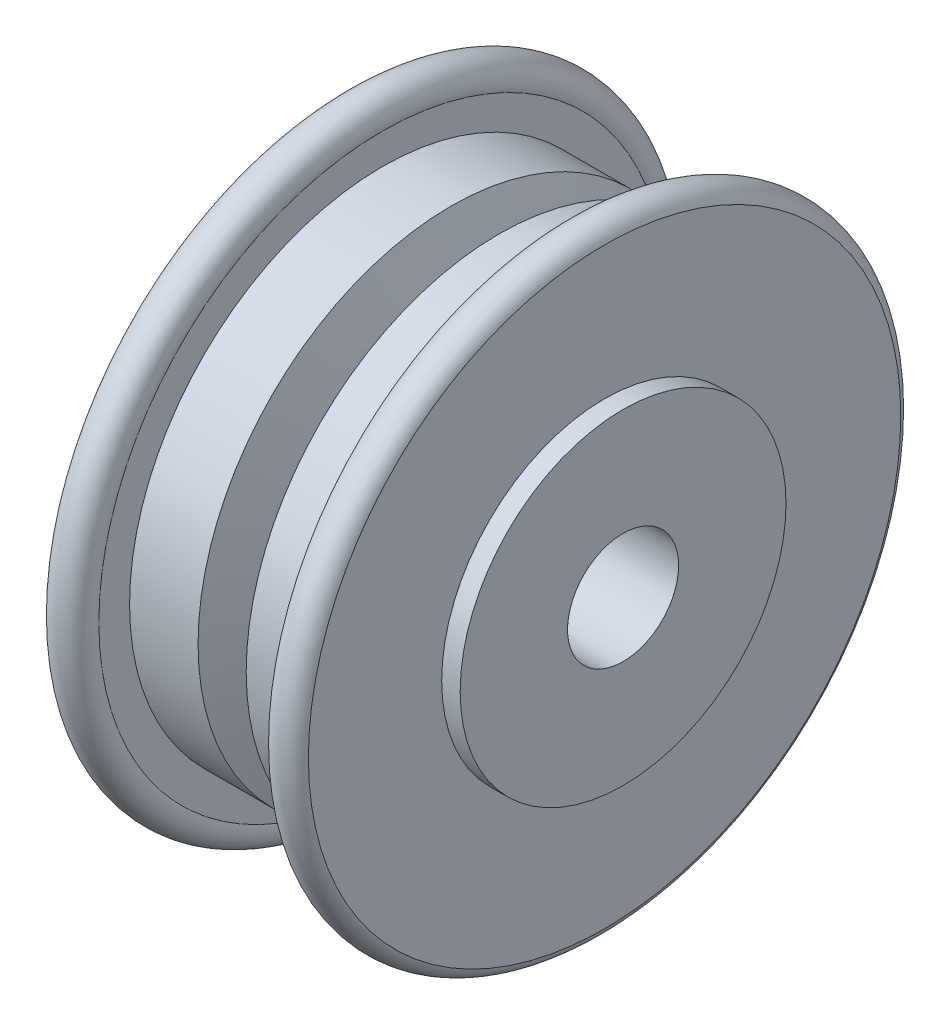
ISO-10303-21;
HEADER;
FILE_DESCRIPTION(('STEP AP214'),'2;1');
FILE_NAME('part.step','',(''),(''),'','','');
FILE_SCHEMA(('AUTOMOTIVE_DESIGN { 1 0 10303 214 1 1 1 1 }'));
ENDSEC;
DATA;
#1=APPLICATION_CONTEXT('core data for automotive mechanical design processes');
#2=APPLICATION_PROTOCOL_DEFINITION('international standard','automotive_design',2000,#1);
#3=PRODUCT_CONTEXT('',#1,'mechanical');
#4=PRODUCT('Part','Part','',(#3));
#5=PRODUCT_RELATED_PRODUCT_CATEGORY('part','',(#4));
#6=PRODUCT_DEFINITION_FORMATION('','',#4);
#7=PRODUCT_DEFINITION_CONTEXT('part definition',#1,'design');
#8=PRODUCT_DEFINITION('design','',#6,#7);
#9=PRODUCT_DEFINITION_SHAPE('','',#8);
#10=(LENGTH_UNIT() NAMED_UNIT(*) SI_UNIT(.MILLI.,.METRE.));
#11=(NAMED_UNIT(*) PLANE_ANGLE_UNIT() SI_UNIT($,.RADIAN.));
#12=(NAMED_UNIT(*) SI_UNIT($,.STERADIAN.) SOLID_ANGLE_UNIT());
#13=UNCERTAINTY_MEASURE_WITH_UNIT(LENGTH_MEASURE(1.E-05),#10,'distance_accuracy_value','');
#14=(GEOMETRIC_REPRESENTATION_CONTEXT(3) GLOBAL_UNCERTAINTY_ASSIGNED_CONTEXT((#13)) GLOBAL_UNIT_ASSIGNED_CONTEXT((#10,
#11,#12)) REPRESENTATION_CONTEXT('',''));
#15=CARTESIAN_POINT('',(0.,0.,0.));
#16=DIRECTION('',(0.,0.,1.));
#17=DIRECTION('',(1.,0.,0.));
#18=AXIS2_PLACEMENT_3D('',#15,#16,#17);
#19=CARTESIAN_POINT('',(4.99999999999886,-1.2872436702413E-13,0.));
#20=DIRECTION('',(1.,0.,0.));
#21=DIRECTION('',(0.,0.,-1.));
#22=AXIS2_PLACEMENT_3D('',#19,#20,#21);
#23=PLANE('',#22);
#24=CARTESIAN_POINT('',(4.99999999999886,0.,0.));
#25=DIRECTION('',(1.,0.,0.));
#26=DIRECTION('',(0.,0.,-1.));
#27=AXIS2_PLACEMENT_3D('',#24,#25,#26);
#28=CIRCLE('',#27,30.);
#29=CARTESIAN_POINT('',(4.99999999999886,0.,-30.));
#30=VERTEX_POINT('',#29);
#31=EDGE_CURVE('E102',#30,#30,#28,.T.);
#32=ORIENTED_EDGE('',*,*,#31,.F.);
#33=EDGE_LOOP('',(#32));
#34=FACE_BOUND('',#33,.T.);
#35=CARTESIAN_POINT('',(4.99999999999999,0.,0.));
#36=DIRECTION('',(-1.,0.,0.));
#37=DIRECTION('',(0.,0.,1.));
#38=AXIS2_PLACEMENT_3D('',#35,#36,#37);
#39=CIRCLE('',#38,88.);
#40=CARTESIAN_POINT('',(4.99999999999999,0.,88.));
#41=VERTEX_POINT('',#40);
#42=EDGE_CURVE('E10',#41,#41,#39,.T.);
#43=ORIENTED_EDGE('',*,*,#42,.F.);
#44=EDGE_LOOP('',(#43));
#45=FACE_BOUND('',#44,.T.);
#46=ADVANCED_FACE('F43',(#34,#45),#23,.T.);
#47=CARTESIAN_POINT('',(0.,0.,0.));
#48=DIRECTION('',(-1.,0.,0.));
#49=DIRECTION('',(0.,0.,1.));
#50=AXIS2_PLACEMENT_3D('',#47,#48,#49);
#51=CYLINDRICAL_SURFACE('',#50,88.);
#52=CARTESIAN_POINT('',(-4.99999999999903,0.,0.));
#53=DIRECTION('',(-1.,0.,0.));
#54=DIRECTION('',(0.,0.,1.));
#55=AXIS2_PLACEMENT_3D('',#52,#53,#54);
#56=CIRCLE('',#55,88.);
#57=CARTESIAN_POINT('',(-4.99999999999903,0.,88.));
#58=VERTEX_POINT('',#57);
#59=EDGE_CURVE('E51',#58,#58,#56,.T.);
#60=ORIENTED_EDGE('',*,*,#59,.F.);
#61=EDGE_LOOP('',(#60));
#62=FACE_BOUND('',#61,.T.);
#63=ORIENTED_EDGE('',*,*,#42,.T.);
#64=EDGE_LOOP('',(#63));
#65=FACE_BOUND('',#64,.T.);
#66=ADVANCED_FACE('F123',(#62,#65),#51,.T.);
#67=CARTESIAN_POINT('',(-4.99999999999956,0.,0.));
#68=DIRECTION('',(1.,0.,0.));
#69=DIRECTION('',(0.,0.,-1.));
#70=AXIS2_PLACEMENT_3D('',#67,#68,#69);
#71=PLANE('',#70);
#72=ORIENTED_EDGE('',*,*,#59,.T.);
#73=EDGE_LOOP('',(#72));
#74=FACE_BOUND('',#73,.T.);
#75=CARTESIAN_POINT('',(-5.00000000000009,0.,0.));
#76=DIRECTION('',(-1.,0.,0.));
#77=DIRECTION('',(0.,0.,1.));
#78=AXIS2_PLACEMENT_3D('',#75,#76,#77);
#79=CIRCLE('',#78,160.);
#80=CARTESIAN_POINT('',(-5.00000000000009,0.,160.));
#81=VERTEX_POINT('',#80);
#82=EDGE_CURVE('E56',#81,#81,#79,.T.);
#83=ORIENTED_EDGE('',*,*,#82,.F.);
#84=EDGE_LOOP('',(#83));
#85=FACE_BOUND('',#84,.T.);
#86=ADVANCED_FACE('F128',(#74,#85),#71,.T.);
#87=CARTESIAN_POINT('',(-15.,0.,0.));
#88=DIRECTION('',(-1.,0.,0.));
#89=DIRECTION('',(0.,0.,1.));
#90=AXIS2_PLACEMENT_3D('',#87,#88,#89);
#91=TOROIDAL_SURFACE('',#90,156.596377259921,10.5633634679861);
#92=CARTESIAN_POINT('',(-25.0000000000001,0.,0.));
#93=DIRECTION('',(-1.,0.,0.));
#94=DIRECTION('',(0.,0.,1.));
#95=AXIS2_PLACEMENT_3D('',#92,#93,#94);
#96=CIRCLE('',#95,153.192754519842);
#97=CARTESIAN_POINT('',(-25.0000000000001,0.,153.192754519842));
#98=VERTEX_POINT('',#97);
#99=EDGE_CURVE('E62',#98,#98,#96,.T.);
#100=ORIENTED_EDGE('',*,*,#99,.F.);
#101=EDGE_LOOP('',(#100));
#102=FACE_BOUND('',#101,.T.);
#103=ORIENTED_EDGE('',*,*,#82,.T.);
#104=EDGE_LOOP('',(#103));
#105=FACE_BOUND('',#104,.T.);
#106=ADVANCED_FACE('F134',(#102,#105),#91,.T.);
#107=CARTESIAN_POINT('',(-25.0000000000002,4.54084213086385E-13,0.));
#108=DIRECTION('',(-1.,0.,0.));
#109=DIRECTION('',(0.,0.,1.));
#110=AXIS2_PLACEMENT_3D('',#107,#108,#109);
#111=PLANE('',#110);
#112=ORIENTED_EDGE('',*,*,#99,.T.);
#113=EDGE_LOOP('',(#112));
#114=FACE_BOUND('',#113,.T.);
#115=CARTESIAN_POINT('',(-25.0000000000002,0.,0.));
#116=DIRECTION('',(-1.,0.,0.));
#117=DIRECTION('',(0.,0.,1.));
#118=AXIS2_PLACEMENT_3D('',#115,#116,#117);
#119=CIRCLE('',#118,136.596377259921);
#120=CARTESIAN_POINT('',(-25.0000000000002,0.,136.596377259921));
#121=VERTEX_POINT('',#120);
#122=EDGE_CURVE('E66',#121,#121,#119,.T.);
#123=ORIENTED_EDGE('',*,*,#122,.F.);
#124=EDGE_LOOP('',(#123));
#125=FACE_BOUND('',#124,.T.);
#126=ADVANCED_FACE('F141',(#114,#125),#111,.T.);
#127=CARTESIAN_POINT('',(0.,0.,0.));
#128=DIRECTION('',(-1.,0.,0.));
#129=DIRECTION('',(0.,0.,1.));
#130=AXIS2_PLACEMENT_3D('',#127,#128,#129);
#131=CYLINDRICAL_SURFACE('',#130,136.596377259921);
#132=ORIENTED_EDGE('',*,*,#122,.T.);
#133=EDGE_LOOP('',(#132));
#134=FACE_BOUND('',#133,.T.);
#135=CARTESIAN_POINT('',(-62.0000000000001,0.,0.));
#136=DIRECTION('',(-1.,0.,0.));
#137=DIRECTION('',(0.,0.,1.));
#138=AXIS2_PLACEMENT_3D('',#135,#136,#137);
#139=CIRCLE('',#138,136.596377259921);
#140=CARTESIAN_POINT('',(-62.0000000000001,0.,136.596377259921));
#141=VERTEX_POINT('',#140);
#142=EDGE_CURVE('E70',#141,#141,#139,.T.);
#143=ORIENTED_EDGE('',*,*,#142,.F.);
#144=EDGE_LOOP('',(#143));
#145=FACE_BOUND('',#144,.T.);
#146=ADVANCED_FACE('F145',(#134,#145),#131,.T.);
#147=CARTESIAN_POINT('',(-62.0000000000001,0.,0.));
#148=DIRECTION('',(1.,0.,0.));
#149=DIRECTION('',(0.,0.,-1.));
#150=AXIS2_PLACEMENT_3D('',#147,#148,#149);
#151=CONICAL_SURFACE('',#150,136.596377259921,1.24374048398407);
#152=CARTESIAN_POINT('',(-75.,0.,0.));
#153=DIRECTION('',(-1.,0.,0.));
#154=DIRECTION('',(0.,0.,1.));
#155=AXIS2_PLACEMENT_3D('',#152,#153,#154);
#156=CIRCLE('',#155,98.2752660210934);
#157=CARTESIAN_POINT('',(-75.,0.,98.2752660210934));
#158=VERTEX_POINT('',#157);
#159=EDGE_CURVE('E74',#158,#158,#156,.T.);
#160=ORIENTED_EDGE('',*,*,#159,.F.);
#161=EDGE_LOOP('',(#160));
#162=FACE_BOUND('',#161,.T.);
#163=ORIENTED_EDGE('',*,*,#142,.T.);
#164=EDGE_LOOP('',(#163));
#165=FACE_BOUND('',#164,.T.);
#166=ADVANCED_FACE('F149',(#162,#165),#151,.T.);
#167=CARTESIAN_POINT('',(-87.9999999999997,0.,0.));
#168=DIRECTION('',(-1.,0.,0.));
#169=DIRECTION('',(0.,0.,1.));
#170=AXIS2_PLACEMENT_3D('',#167,#168,#169);
#171=CONICAL_SURFACE('',#170,136.596377259921,1.24374048398407);
#172=ORIENTED_EDGE('',*,*,#159,.T.);
#173=EDGE_LOOP('',(#172));
#174=FACE_BOUND('',#173,.T.);
#175=CARTESIAN_POINT('',(-87.9999999999997,0.,0.));
#176=DIRECTION('',(-1.,0.,0.));
#177=DIRECTION('',(0.,0.,1.));
#178=AXIS2_PLACEMENT_3D('',#175,#176,#177);
#179=CIRCLE('',#178,136.596377259921);
#180=CARTESIAN_POINT('',(-87.9999999999997,0.,136.596377259921));
#181=VERTEX_POINT('',#180);
#182=EDGE_CURVE('E78',#181,#181,#179,.T.);
#183=ORIENTED_EDGE('',*,*,#182,.F.);
#184=EDGE_LOOP('',(#183));
#185=FACE_BOUND('',#184,.T.);
#186=ADVANCED_FACE('F153',(#174,#185),#171,.T.);
#187=CARTESIAN_POINT('',(0.,0.,0.));
#188=DIRECTION('',(-1.,0.,0.));
#189=DIRECTION('',(0.,0.,1.));
#190=AXIS2_PLACEMENT_3D('',#187,#188,#189);
#191=CYLINDRICAL_SURFACE('',#190,136.596377259921);
#192=CARTESIAN_POINT('',(-125.,0.,0.));
#193=DIRECTION('',(-1.,0.,0.));
#194=DIRECTION('',(0.,0.,1.));
#195=AXIS2_PLACEMENT_3D('',#192,#193,#194);
#196=CIRCLE('',#195,136.596377259921);
#197=CARTESIAN_POINT('',(-125.,0.,136.596377259921));
#198=VERTEX_POINT('',#197);
#199=EDGE_CURVE('E82',#198,#198,#196,.T.);
#200=ORIENTED_EDGE('',*,*,#199,.F.);
#201=EDGE_LOOP('',(#200));
#202=FACE_BOUND('',#201,.T.);
#203=ORIENTED_EDGE('',*,*,#182,.T.);
#204=EDGE_LOOP('',(#203));
#205=FACE_BOUND('',#204,.T.);
#206=ADVANCED_FACE('F157',(#202,#205),#191,.T.);
#207=CARTESIAN_POINT('',(-125.,1.13237958375644E-13,0.));
#208=DIRECTION('',(-1.,0.,0.));
#209=DIRECTION('',(0.,0.,1.));
#210=AXIS2_PLACEMENT_3D('',#207,#208,#209);
#211=PLANE('',#210);
#212=CARTESIAN_POINT('',(-125.,0.,0.));
#213=DIRECTION('',(-1.,0.,0.));
#214=DIRECTION('',(0.,0.,1.));
#215=AXIS2_PLACEMENT_3D('',#212,#213,#214);
#216=CIRCLE('',#215,153.192754519842);
#217=CARTESIAN_POINT('',(-125.,0.,153.192754519842));
#218=VERTEX_POINT('',#217);
#219=EDGE_CURVE('E86',#218,#218,#216,.T.);
#220=ORIENTED_EDGE('',*,*,#219,.F.);
#221=EDGE_LOOP('',(#220));
#222=FACE_BOUND('',#221,.T.);
#223=ORIENTED_EDGE('',*,*,#199,.T.);
#224=EDGE_LOOP('',(#223));
#225=FACE_BOUND('',#224,.T.);
#226=ADVANCED_FACE('F161',(#222,#225),#211,.F.);
#227=CARTESIAN_POINT('',(-135.,0.,0.));
#228=DIRECTION('',(-1.,0.,0.));
#229=DIRECTION('',(0.,0.,1.));
#230=AXIS2_PLACEMENT_3D('',#227,#228,#229);
#231=TOROIDAL_SURFACE('',#230,156.596377259921,10.5633634679861);
#232=ORIENTED_EDGE('',*,*,#219,.T.);
#233=EDGE_LOOP('',(#232));
#234=FACE_BOUND('',#233,.T.);
#235=CARTESIAN_POINT('',(-145.,0.,0.));
#236=DIRECTION('',(-1.,0.,0.));
#237=DIRECTION('',(0.,0.,1.));
#238=AXIS2_PLACEMENT_3D('',#235,#236,#237);
#239=CIRCLE('',#238,160.);
#240=CARTESIAN_POINT('',(-145.,0.,160.));
#241=VERTEX_POINT('',#240);
#242=EDGE_CURVE('E90',#241,#241,#239,.T.);
#243=ORIENTED_EDGE('',*,*,#242,.F.);
#244=EDGE_LOOP('',(#243));
#245=FACE_BOUND('',#244,.T.);
#246=ADVANCED_FACE('F165',(#234,#245),#231,.T.);
#247=CARTESIAN_POINT('',(-145.,4.7540096859146E-12,0.));
#248=DIRECTION('',(1.,0.,0.));
#249=DIRECTION('',(0.,0.,-1.));
#250=AXIS2_PLACEMENT_3D('',#247,#248,#249);
#251=PLANE('',#250);
#252=CARTESIAN_POINT('',(-145.000000000001,0.,0.));
#253=DIRECTION('',(-1.,0.,0.));
#254=DIRECTION('',(0.,0.,1.));
#255=AXIS2_PLACEMENT_3D('',#252,#253,#254);
#256=CIRCLE('',#255,88.0000000000001);
#257=CARTESIAN_POINT('',(-145.000000000001,0.,88.0000000000001));
#258=VERTEX_POINT('',#257);
#259=EDGE_CURVE('E94',#258,#258,#256,.T.);
#260=ORIENTED_EDGE('',*,*,#259,.F.);
#261=EDGE_LOOP('',(#260));
#262=FACE_BOUND('',#261,.T.);
#263=ORIENTED_EDGE('',*,*,#242,.T.);
#264=EDGE_LOOP('',(#263));
#265=FACE_BOUND('',#264,.T.);
#266=ADVANCED_FACE('F169',(#262,#265),#251,.F.);
#267=CARTESIAN_POINT('',(0.,0.,0.));
#268=DIRECTION('',(-1.,0.,0.));
#269=DIRECTION('',(0.,0.,1.));
#270=AXIS2_PLACEMENT_3D('',#267,#268,#269);
#271=CYLINDRICAL_SURFACE('',#270,88.0000000000001);
#272=ORIENTED_EDGE('',*,*,#259,.T.);
#273=EDGE_LOOP('',(#272));
#274=FACE_BOUND('',#273,.T.);
#275=CARTESIAN_POINT('',(-155.,0.,0.));
#276=DIRECTION('',(-1.,0.,0.));
#277=DIRECTION('',(0.,0.,1.));
#278=AXIS2_PLACEMENT_3D('',#275,#276,#277);
#279=CIRCLE('',#278,88.0000000000001);
#280=CARTESIAN_POINT('',(-155.,0.,88.0000000000001));
#281=VERTEX_POINT('',#280);
#282=EDGE_CURVE('E98',#281,#281,#279,.T.);
#283=ORIENTED_EDGE('',*,*,#282,.F.);
#284=EDGE_LOOP('',(#283));
#285=FACE_BOUND('',#284,.T.);
#286=ADVANCED_FACE('F120',(#274,#285),#271,.T.);
#287=CARTESIAN_POINT('',(-155.,1.17330387829704E-12,0.));
#288=DIRECTION('',(1.,0.,0.));
#289=DIRECTION('',(0.,0.,-1.));
#290=AXIS2_PLACEMENT_3D('',#287,#288,#289);
#291=PLANE('',#290);
#292=CARTESIAN_POINT('',(-155.,0.,0.));
#293=DIRECTION('',(1.,0.,0.));
#294=DIRECTION('',(0.,0.,-1.));
#295=AXIS2_PLACEMENT_3D('',#292,#293,#294);
#296=CIRCLE('',#295,30.);
#297=CARTESIAN_POINT('',(-155.,0.,-30.));
#298=VERTEX_POINT('',#297);
#299=EDGE_CURVE('E46',#298,#298,#296,.T.);
#300=ORIENTED_EDGE('',*,*,#299,.T.);
#301=EDGE_LOOP('',(#300));
#302=FACE_BOUND('',#301,.T.);
#303=ORIENTED_EDGE('',*,*,#282,.T.);
#304=EDGE_LOOP('',(#303));
#305=FACE_BOUND('',#304,.T.);
#306=ADVANCED_FACE('F111',(#302,#305),#291,.F.);
#307=CARTESIAN_POINT('',(-495.000000000001,0.,0.));
#308=DIRECTION('',(1.,0.,0.));
#309=DIRECTION('',(0.,0.,-1.));
#310=AXIS2_PLACEMENT_3D('',#307,#308,#309);
#311=CYLINDRICAL_SURFACE('',#310,30.);
#312=ORIENTED_EDGE('',*,*,#31,.T.);
#313=EDGE_LOOP('',(#312));
#314=FACE_BOUND('',#313,.T.);
#315=ORIENTED_EDGE('',*,*,#299,.F.);
#316=EDGE_LOOP('',(#315));
#317=FACE_BOUND('',#316,.T.);
#318=ADVANCED_FACE('F114',(#314,#317),#311,.F.);
#319=CLOSED_SHELL('',(#46,#66,#86,#106,#126,#146,#166,#186,#206,#226,#246,#266,#286,#306,#318));
#320=MANIFOLD_SOLID_BREP('B2',#319);
#321=ADVANCED_BREP_SHAPE_REPRESENTATION('',(#18,#320),#14);
#322=SHAPE_DEFINITION_REPRESENTATION(#9,#321);
ENDSEC;
END-ISO-10303-21;
